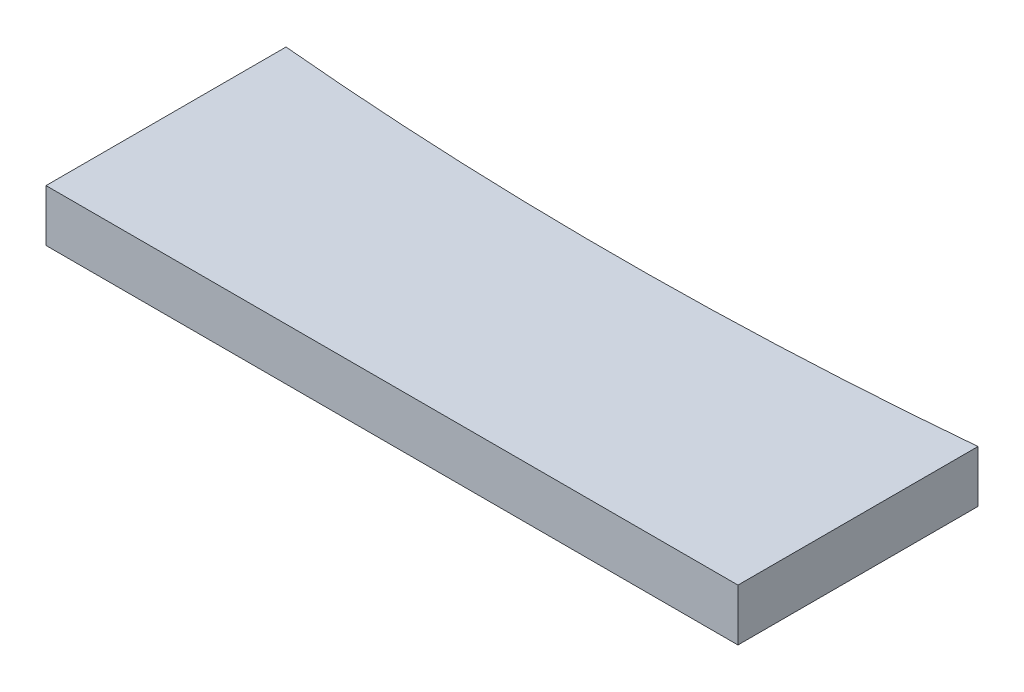
ISO-10303-21;
HEADER;
FILE_DESCRIPTION(('STEP AP214'),'2;1');
FILE_NAME('part.step','',(''),(''),'','','');
FILE_SCHEMA(('AUTOMOTIVE_DESIGN { 1 0 10303 214 1 1 1 1 }'));
ENDSEC;
DATA;
#1=APPLICATION_CONTEXT('core data for automotive mechanical design processes');
#2=APPLICATION_PROTOCOL_DEFINITION('international standard','automotive_design',2000,#1);
#3=PRODUCT_CONTEXT('',#1,'mechanical');
#4=PRODUCT('Part','Part','',(#3));
#5=PRODUCT_RELATED_PRODUCT_CATEGORY('part','',(#4));
#6=PRODUCT_DEFINITION_FORMATION('','',#4);
#7=PRODUCT_DEFINITION_CONTEXT('part definition',#1,'design');
#8=PRODUCT_DEFINITION('design','',#6,#7);
#9=PRODUCT_DEFINITION_SHAPE('','',#8);
#10=(LENGTH_UNIT() NAMED_UNIT(*) SI_UNIT(.MILLI.,.METRE.));
#11=(NAMED_UNIT(*) PLANE_ANGLE_UNIT() SI_UNIT($,.RADIAN.));
#12=(NAMED_UNIT(*) SI_UNIT($,.STERADIAN.) SOLID_ANGLE_UNIT());
#13=UNCERTAINTY_MEASURE_WITH_UNIT(LENGTH_MEASURE(1.E-05),#10,'distance_accuracy_value','');
#14=(GEOMETRIC_REPRESENTATION_CONTEXT(3) GLOBAL_UNCERTAINTY_ASSIGNED_CONTEXT((#13)) GLOBAL_UNIT_ASSIGNED_CONTEXT((#10,
#11,#12)) REPRESENTATION_CONTEXT('',''));
#15=CARTESIAN_POINT('',(0.,0.,0.));
#16=DIRECTION('',(0.,0.,1.));
#17=DIRECTION('',(1.,0.,0.));
#18=AXIS2_PLACEMENT_3D('',#15,#16,#17);
#19=CARTESIAN_POINT('',(-5.07999999999999,0.762,0.));
#20=DIRECTION('',(1.,0.,0.));
#21=DIRECTION('',(0.,0.,-1.));
#22=AXIS2_PLACEMENT_3D('',#19,#20,#21);
#23=PLANE('',#22);
#24=DIRECTION('',(0.,0.,1.));
#25=VECTOR('',#24,1.);
#26=CARTESIAN_POINT('',(-5.07999999999999,0.,0.));
#27=LINE('',#26,#25);
#28=CARTESIAN_POINT('',(-5.07999999999999,0.,55.3297840791919));
#29=VERTEX_POINT('',#28);
#30=CARTESIAN_POINT('',(-5.07999999999999,0.,58.8541019937476));
#31=VERTEX_POINT('',#30);
#32=EDGE_CURVE('E107',#29,#31,#27,.T.);
#33=ORIENTED_EDGE('',*,*,#32,.T.);
#34=DIRECTION('',(0.,-1.,0.));
#35=VECTOR('',#34,1.);
#36=CARTESIAN_POINT('',(-5.07999999999999,0.762,58.8541019937476));
#37=LINE('',#36,#35);
#38=CARTESIAN_POINT('',(-5.07999999999999,0.762,58.8541019937476));
#39=VERTEX_POINT('',#38);
#40=EDGE_CURVE('E11',#39,#31,#37,.T.);
#41=ORIENTED_EDGE('',*,*,#40,.F.);
#42=DIRECTION('',(0.,0.,1.));
#43=VECTOR('',#42,1.);
#44=CARTESIAN_POINT('',(-5.07999999999999,0.762,0.));
#45=LINE('',#44,#43);
#46=CARTESIAN_POINT('',(-5.07999999999999,0.762,55.3297840791919));
#47=VERTEX_POINT('',#46);
#48=EDGE_CURVE('E93',#47,#39,#45,.T.);
#49=ORIENTED_EDGE('',*,*,#48,.F.);
#50=DIRECTION('',(0.,-1.,0.));
#51=VECTOR('',#50,1.);
#52=CARTESIAN_POINT('',(-5.07999999999999,0.762,55.3297840791919));
#53=LINE('',#52,#51);
#54=EDGE_CURVE('E60',#47,#29,#53,.T.);
#55=ORIENTED_EDGE('',*,*,#54,.T.);
#56=EDGE_LOOP('',(#33,#41,#49,#55));
#57=FACE_BOUND('',#56,.T.);
#58=ADVANCED_FACE('F44',(#57),#23,.F.);
#59=CARTESIAN_POINT('',(0.,0.762,58.8541019937476));
#60=DIRECTION('',(0.,0.,-1.));
#61=DIRECTION('',(-1.,0.,0.));
#62=AXIS2_PLACEMENT_3D('',#59,#60,#61);
#63=PLANE('',#62);
#64=DIRECTION('',(1.,0.,0.));
#65=VECTOR('',#64,1.);
#66=CARTESIAN_POINT('',(0.,0.,58.8541019937476));
#67=LINE('',#66,#65);
#68=CARTESIAN_POINT('',(5.08000000000001,0.,58.8541019937476));
#69=VERTEX_POINT('',#68);
#70=EDGE_CURVE('E98',#31,#69,#67,.T.);
#71=ORIENTED_EDGE('',*,*,#70,.T.);
#72=DIRECTION('',(0.,-1.,0.));
#73=VECTOR('',#72,1.);
#74=CARTESIAN_POINT('',(5.08000000000001,0.762,58.8541019937476));
#75=LINE('',#74,#73);
#76=CARTESIAN_POINT('',(5.08000000000001,0.762,58.8541019937476));
#77=VERTEX_POINT('',#76);
#78=EDGE_CURVE('E52',#77,#69,#75,.T.);
#79=ORIENTED_EDGE('',*,*,#78,.F.);
#80=DIRECTION('',(1.,0.,0.));
#81=VECTOR('',#80,1.);
#82=CARTESIAN_POINT('',(0.,0.762,58.8541019937476));
#83=LINE('',#82,#81);
#84=EDGE_CURVE('E85',#39,#77,#83,.T.);
#85=ORIENTED_EDGE('',*,*,#84,.F.);
#86=ORIENTED_EDGE('',*,*,#40,.T.);
#87=EDGE_LOOP('',(#71,#79,#85,#86));
#88=FACE_BOUND('',#87,.T.);
#89=ADVANCED_FACE('F97',(#88),#63,.F.);
#90=CARTESIAN_POINT('',(5.08000000000001,0.762,0.));
#91=DIRECTION('',(1.,0.,0.));
#92=DIRECTION('',(0.,0.,-1.));
#93=AXIS2_PLACEMENT_3D('',#90,#91,#92);
#94=PLANE('',#93);
#95=DIRECTION('',(0.,0.,1.));
#96=VECTOR('',#95,1.);
#97=CARTESIAN_POINT('',(5.08000000000001,0.,0.));
#98=LINE('',#97,#96);
#99=CARTESIAN_POINT('',(5.08000000000001,0.,55.3297840791919));
#100=VERTEX_POINT('',#99);
#101=EDGE_CURVE('E110',#100,#69,#98,.T.);
#102=ORIENTED_EDGE('',*,*,#101,.F.);
#103=DIRECTION('',(0.,-1.,0.));
#104=VECTOR('',#103,1.);
#105=CARTESIAN_POINT('',(5.08000000000001,0.762,55.3297840791919));
#106=LINE('',#105,#104);
#107=CARTESIAN_POINT('',(5.08000000000001,0.762,55.3297840791919));
#108=VERTEX_POINT('',#107);
#109=EDGE_CURVE('E74',#108,#100,#106,.T.);
#110=ORIENTED_EDGE('',*,*,#109,.F.);
#111=DIRECTION('',(0.,0.,1.));
#112=VECTOR('',#111,1.);
#113=CARTESIAN_POINT('',(5.08000000000001,0.762,0.));
#114=LINE('',#113,#112);
#115=EDGE_CURVE('E92',#108,#77,#114,.T.);
#116=ORIENTED_EDGE('',*,*,#115,.T.);
#117=ORIENTED_EDGE('',*,*,#78,.T.);
#118=EDGE_LOOP('',(#102,#110,#116,#117));
#119=FACE_BOUND('',#118,.T.);
#120=ADVANCED_FACE('F101',(#119),#94,.T.);
#121=CARTESIAN_POINT('',(0.,0.762,0.));
#122=DIRECTION('',(0.,-1.,0.));
#123=DIRECTION('',(0.,0.,-1.));
#124=AXIS2_PLACEMENT_3D('',#121,#122,#123);
#125=CYLINDRICAL_SURFACE('',#124,55.5625);
#126=CARTESIAN_POINT('',(0.,0.,0.));
#127=DIRECTION('',(0.,1.,0.));
#128=DIRECTION('',(0.,0.,1.));
#129=AXIS2_PLACEMENT_3D('',#126,#127,#128);
#130=CIRCLE('',#129,55.5625);
#131=EDGE_CURVE('E112',#29,#100,#130,.T.);
#132=ORIENTED_EDGE('',*,*,#131,.F.);
#133=ORIENTED_EDGE('',*,*,#54,.F.);
#134=CARTESIAN_POINT('',(0.,0.762,0.));
#135=DIRECTION('',(0.,1.,0.));
#136=DIRECTION('',(0.,0.,1.));
#137=AXIS2_PLACEMENT_3D('',#134,#135,#136);
#138=CIRCLE('',#137,55.5625);
#139=EDGE_CURVE('E102',#47,#108,#138,.T.);
#140=ORIENTED_EDGE('',*,*,#139,.T.);
#141=ORIENTED_EDGE('',*,*,#109,.T.);
#142=EDGE_LOOP('',(#132,#133,#140,#141));
#143=FACE_BOUND('',#142,.T.);
#144=ADVANCED_FACE('F118',(#143),#125,.F.);
#145=CARTESIAN_POINT('',(0.,0.762,0.));
#146=DIRECTION('',(0.,1.,0.));
#147=DIRECTION('',(0.,0.,1.));
#148=AXIS2_PLACEMENT_3D('',#145,#146,#147);
#149=PLANE('',#148);
#150=ORIENTED_EDGE('',*,*,#48,.T.);
#151=ORIENTED_EDGE('',*,*,#84,.T.);
#152=ORIENTED_EDGE('',*,*,#115,.F.);
#153=ORIENTED_EDGE('',*,*,#139,.F.);
#154=EDGE_LOOP('',(#150,#151,#152,#153));
#155=FACE_BOUND('',#154,.T.);
#156=ADVANCED_FACE('F89',(#155),#149,.T.);
#157=CARTESIAN_POINT('',(0.,0.,0.));
#158=DIRECTION('',(0.,1.,0.));
#159=DIRECTION('',(0.,0.,1.));
#160=AXIS2_PLACEMENT_3D('',#157,#158,#159);
#161=PLANE('',#160);
#162=ORIENTED_EDGE('',*,*,#32,.F.);
#163=ORIENTED_EDGE('',*,*,#131,.T.);
#164=ORIENTED_EDGE('',*,*,#101,.T.);
#165=ORIENTED_EDGE('',*,*,#70,.F.);
#166=EDGE_LOOP('',(#162,#163,#164,#165));
#167=FACE_BOUND('',#166,.T.);
#168=ADVANCED_FACE('F117',(#167),#161,.F.);
#169=CLOSED_SHELL('',(#58,#89,#120,#144,#156,#168));
#170=MANIFOLD_SOLID_BREP('B2',#169);
#171=ADVANCED_BREP_SHAPE_REPRESENTATION('',(#18,#170),#14);
#172=SHAPE_DEFINITION_REPRESENTATION(#9,#171);
ENDSEC;
END-ISO-10303-21;
